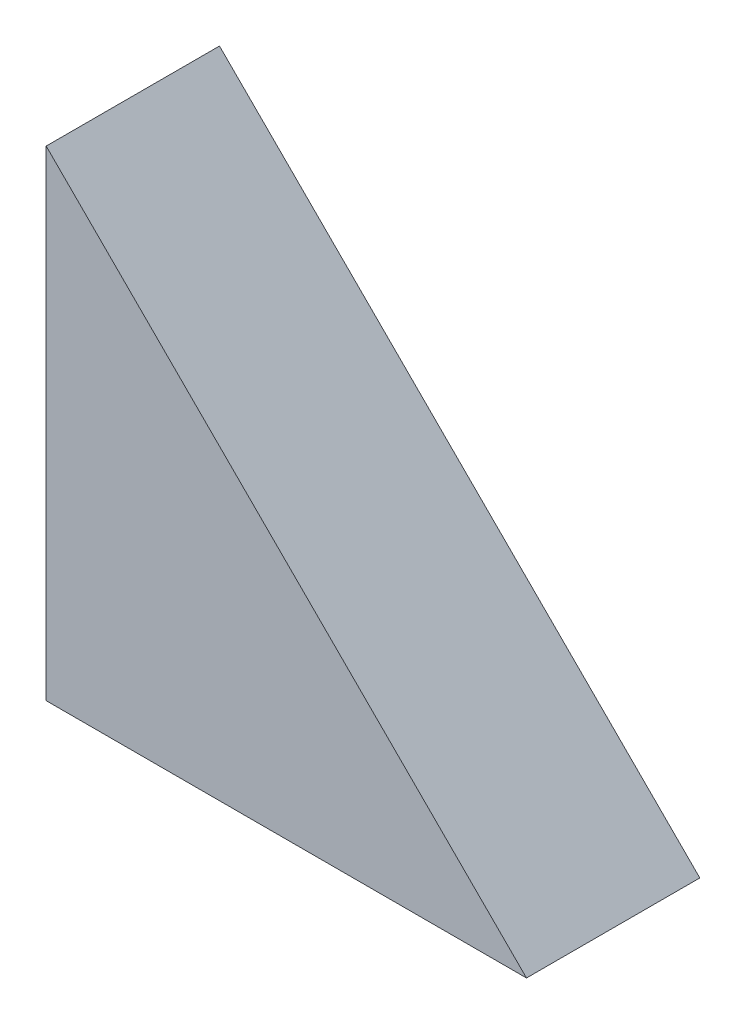
ISO-10303-21;
HEADER;
FILE_DESCRIPTION(('STEP AP214'),'2;1');
FILE_NAME('part.step','',(''),(''),'','','');
FILE_SCHEMA(('AUTOMOTIVE_DESIGN { 1 0 10303 214 1 1 1 1 }'));
ENDSEC;
DATA;
#1=APPLICATION_CONTEXT('core data for automotive mechanical design processes');
#2=APPLICATION_PROTOCOL_DEFINITION('international standard','automotive_design',2000,#1);
#3=PRODUCT_CONTEXT('',#1,'mechanical');
#4=PRODUCT('Part','Part','',(#3));
#5=PRODUCT_RELATED_PRODUCT_CATEGORY('part','',(#4));
#6=PRODUCT_DEFINITION_FORMATION('','',#4);
#7=PRODUCT_DEFINITION_CONTEXT('part definition',#1,'design');
#8=PRODUCT_DEFINITION('design','',#6,#7);
#9=PRODUCT_DEFINITION_SHAPE('','',#8);
#10=(LENGTH_UNIT() NAMED_UNIT(*) SI_UNIT(.MILLI.,.METRE.));
#11=(NAMED_UNIT(*) PLANE_ANGLE_UNIT() SI_UNIT($,.RADIAN.));
#12=(NAMED_UNIT(*) SI_UNIT($,.STERADIAN.) SOLID_ANGLE_UNIT());
#13=UNCERTAINTY_MEASURE_WITH_UNIT(LENGTH_MEASURE(1.E-05),#10,'distance_accuracy_value','');
#14=(GEOMETRIC_REPRESENTATION_CONTEXT(3) GLOBAL_UNCERTAINTY_ASSIGNED_CONTEXT((#13)) GLOBAL_UNIT_ASSIGNED_CONTEXT((#10,
#11,#12)) REPRESENTATION_CONTEXT('',''));
#15=CARTESIAN_POINT('',(0.,0.,0.));
#16=DIRECTION('',(0.,0.,1.));
#17=DIRECTION('',(1.,0.,0.));
#18=AXIS2_PLACEMENT_3D('',#15,#16,#17);
#19=CARTESIAN_POINT('',(0.,97.,35.));
#20=DIRECTION('',(1.,0.,0.));
#21=DIRECTION('',(0.,1.,0.));
#22=AXIS2_PLACEMENT_3D('',#19,#20,#21);
#23=PLANE('',#22);
#24=DIRECTION('',(0.,-1.,0.));
#25=VECTOR('',#24,1.);
#26=CARTESIAN_POINT('',(0.,97.,0.));
#27=LINE('',#26,#25);
#28=CARTESIAN_POINT('',(0.,97.,0.));
#29=VERTEX_POINT('',#28);
#30=CARTESIAN_POINT('',(0.,0.,0.));
#31=VERTEX_POINT('',#30);
#32=EDGE_CURVE('E81',#29,#31,#27,.T.);
#33=ORIENTED_EDGE('',*,*,#32,.T.);
#34=DIRECTION('',(0.,0.,-1.));
#35=VECTOR('',#34,1.);
#36=CARTESIAN_POINT('',(0.,0.,35.));
#37=LINE('',#36,#35);
#38=CARTESIAN_POINT('',(0.,0.,35.));
#39=VERTEX_POINT('',#38);
#40=EDGE_CURVE('E11',#39,#31,#37,.T.);
#41=ORIENTED_EDGE('',*,*,#40,.F.);
#42=DIRECTION('',(0.,-1.,0.));
#43=VECTOR('',#42,1.);
#44=CARTESIAN_POINT('',(0.,97.,35.));
#45=LINE('',#44,#43);
#46=CARTESIAN_POINT('',(0.,97.,35.));
#47=VERTEX_POINT('',#46);
#48=EDGE_CURVE('E74',#47,#39,#45,.T.);
#49=ORIENTED_EDGE('',*,*,#48,.F.);
#50=DIRECTION('',(0.,0.,-1.));
#51=VECTOR('',#50,1.);
#52=CARTESIAN_POINT('',(0.,97.,35.));
#53=LINE('',#52,#51);
#54=EDGE_CURVE('E82',#47,#29,#53,.T.);
#55=ORIENTED_EDGE('',*,*,#54,.T.);
#56=EDGE_LOOP('',(#33,#41,#49,#55));
#57=FACE_BOUND('',#56,.T.);
#58=ADVANCED_FACE('F34',(#57),#23,.F.);
#59=CARTESIAN_POINT('',(0.,0.,35.));
#60=DIRECTION('',(0.,1.,0.));
#61=DIRECTION('',(0.,0.,1.));
#62=AXIS2_PLACEMENT_3D('',#59,#60,#61);
#63=PLANE('',#62);
#64=DIRECTION('',(1.,0.,0.));
#65=VECTOR('',#64,1.);
#66=CARTESIAN_POINT('',(0.,0.,0.));
#67=LINE('',#66,#65);
#68=CARTESIAN_POINT('',(97.,0.,0.));
#69=VERTEX_POINT('',#68);
#70=EDGE_CURVE('E62',#31,#69,#67,.T.);
#71=ORIENTED_EDGE('',*,*,#70,.T.);
#72=DIRECTION('',(0.,0.,-1.));
#73=VECTOR('',#72,1.);
#74=CARTESIAN_POINT('',(97.,0.,35.));
#75=LINE('',#74,#73);
#76=CARTESIAN_POINT('',(97.,0.,35.));
#77=VERTEX_POINT('',#76);
#78=EDGE_CURVE('E42',#77,#69,#75,.T.);
#79=ORIENTED_EDGE('',*,*,#78,.F.);
#80=DIRECTION('',(1.,0.,0.));
#81=VECTOR('',#80,1.);
#82=CARTESIAN_POINT('',(0.,0.,35.));
#83=LINE('',#82,#81);
#84=EDGE_CURVE('E70',#39,#77,#83,.T.);
#85=ORIENTED_EDGE('',*,*,#84,.F.);
#86=ORIENTED_EDGE('',*,*,#40,.T.);
#87=EDGE_LOOP('',(#71,#79,#85,#86));
#88=FACE_BOUND('',#87,.T.);
#89=ADVANCED_FACE('F71',(#88),#63,.F.);
#90=CARTESIAN_POINT('',(97.,0.,35.));
#91=DIRECTION('',(-0.707106781186548,-0.707106781186548,0.));
#92=DIRECTION('',(0.707106781186548,-0.707106781186548,0.));
#93=AXIS2_PLACEMENT_3D('',#90,#91,#92);
#94=PLANE('',#93);
#95=DIRECTION('',(-0.707106781186547,0.707106781186547,0.));
#96=VECTOR('',#95,1.);
#97=CARTESIAN_POINT('',(97.,0.,0.));
#98=LINE('',#97,#96);
#99=EDGE_CURVE('E67',#69,#29,#98,.T.);
#100=ORIENTED_EDGE('',*,*,#99,.T.);
#101=ORIENTED_EDGE('',*,*,#54,.F.);
#102=DIRECTION('',(-0.707106781186547,0.707106781186547,0.));
#103=VECTOR('',#102,1.);
#104=CARTESIAN_POINT('',(97.,0.,35.));
#105=LINE('',#104,#103);
#106=EDGE_CURVE('E50',#77,#47,#105,.T.);
#107=ORIENTED_EDGE('',*,*,#106,.F.);
#108=ORIENTED_EDGE('',*,*,#78,.T.);
#109=EDGE_LOOP('',(#100,#101,#107,#108));
#110=FACE_BOUND('',#109,.T.);
#111=ADVANCED_FACE('F89',(#110),#94,.F.);
#112=CARTESIAN_POINT('',(0.,0.,35.));
#113=DIRECTION('',(0.,0.,1.));
#114=DIRECTION('',(1.,0.,0.));
#115=AXIS2_PLACEMENT_3D('',#112,#113,#114);
#116=PLANE('',#115);
#117=ORIENTED_EDGE('',*,*,#48,.T.);
#118=ORIENTED_EDGE('',*,*,#84,.T.);
#119=ORIENTED_EDGE('',*,*,#106,.T.);
#120=EDGE_LOOP('',(#117,#118,#119));
#121=FACE_BOUND('',#120,.T.);
#122=ADVANCED_FACE('F77',(#121),#116,.T.);
#123=CARTESIAN_POINT('',(0.,0.,0.));
#124=DIRECTION('',(0.,0.,1.));
#125=DIRECTION('',(1.,0.,0.));
#126=AXIS2_PLACEMENT_3D('',#123,#124,#125);
#127=PLANE('',#126);
#128=ORIENTED_EDGE('',*,*,#32,.F.);
#129=ORIENTED_EDGE('',*,*,#99,.F.);
#130=ORIENTED_EDGE('',*,*,#70,.F.);
#131=EDGE_LOOP('',(#128,#129,#130));
#132=FACE_BOUND('',#131,.T.);
#133=ADVANCED_FACE('F90',(#132),#127,.F.);
#134=CLOSED_SHELL('',(#58,#89,#111,#122,#133));
#135=MANIFOLD_SOLID_BREP('B2',#134);
#136=ADVANCED_BREP_SHAPE_REPRESENTATION('',(#18,#135),#14);
#137=SHAPE_DEFINITION_REPRESENTATION(#9,#136);
ENDSEC;
END-ISO-10303-21;
